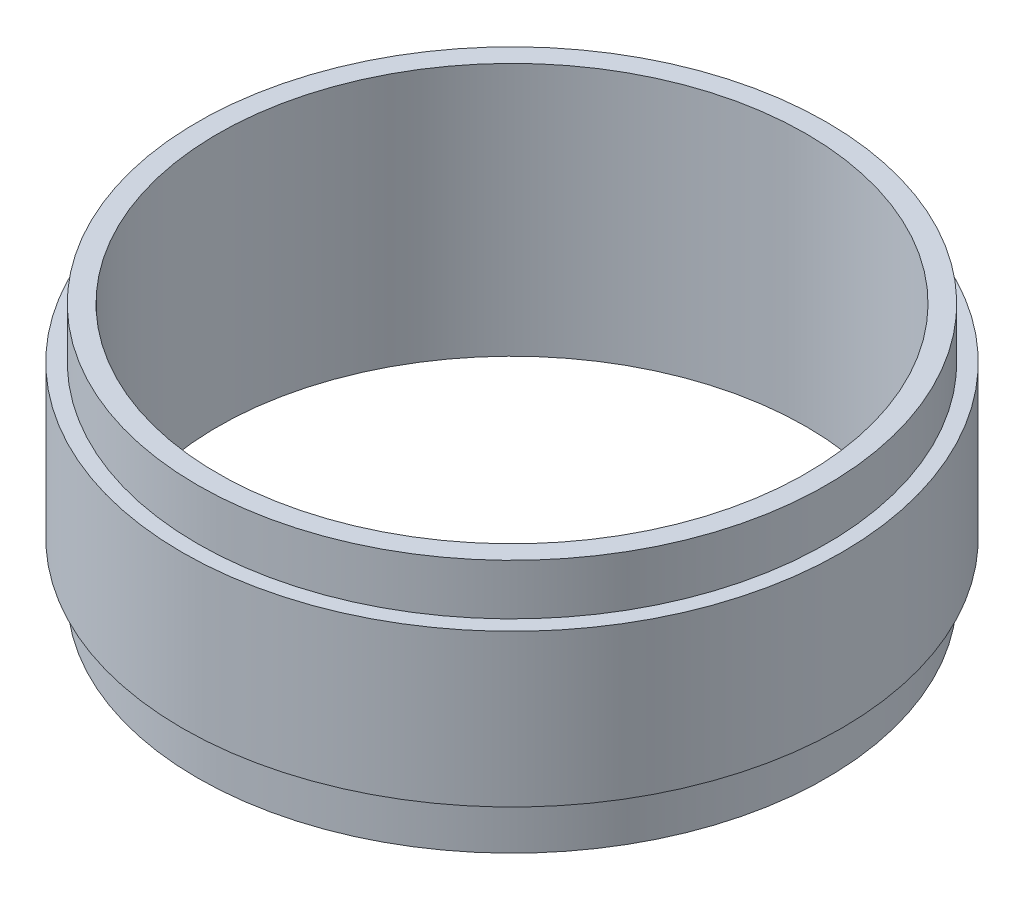
ISO-10303-21;
HEADER;
FILE_DESCRIPTION(('STEP AP214'),'2;1');
FILE_NAME('part.step','',(''),(''),'','','');
FILE_SCHEMA(('AUTOMOTIVE_DESIGN { 1 0 10303 214 1 1 1 1 }'));
ENDSEC;
DATA;
#1=APPLICATION_CONTEXT('core data for automotive mechanical design processes');
#2=APPLICATION_PROTOCOL_DEFINITION('international standard','automotive_design',2000,#1);
#3=PRODUCT_CONTEXT('',#1,'mechanical');
#4=PRODUCT('Part','Part','',(#3));
#5=PRODUCT_RELATED_PRODUCT_CATEGORY('part','',(#4));
#6=PRODUCT_DEFINITION_FORMATION('','',#4);
#7=PRODUCT_DEFINITION_CONTEXT('part definition',#1,'design');
#8=PRODUCT_DEFINITION('design','',#6,#7);
#9=PRODUCT_DEFINITION_SHAPE('','',#8);
#10=(LENGTH_UNIT() NAMED_UNIT(*) SI_UNIT(.MILLI.,.METRE.));
#11=(NAMED_UNIT(*) PLANE_ANGLE_UNIT() SI_UNIT($,.RADIAN.));
#12=(NAMED_UNIT(*) SI_UNIT($,.STERADIAN.) SOLID_ANGLE_UNIT());
#13=UNCERTAINTY_MEASURE_WITH_UNIT(LENGTH_MEASURE(1.E-05),#10,'distance_accuracy_value','');
#14=(GEOMETRIC_REPRESENTATION_CONTEXT(3) GLOBAL_UNCERTAINTY_ASSIGNED_CONTEXT((#13)) GLOBAL_UNIT_ASSIGNED_CONTEXT((#10,
#11,#12)) REPRESENTATION_CONTEXT('',''));
#15=CARTESIAN_POINT('',(0.,0.,0.));
#16=DIRECTION('',(0.,0.,1.));
#17=DIRECTION('',(1.,0.,0.));
#18=AXIS2_PLACEMENT_3D('',#15,#16,#17);
#19=CARTESIAN_POINT('',(0.,0.,0.));
#20=DIRECTION('',(0.,-1.,0.));
#21=DIRECTION('',(0.,0.,-1.));
#22=AXIS2_PLACEMENT_3D('',#19,#20,#21);
#23=CYLINDRICAL_SURFACE('',#22,62.);
#24=CARTESIAN_POINT('',(0.,50.,0.));
#25=DIRECTION('',(0.,-1.,0.));
#26=DIRECTION('',(0.,0.,-1.));
#27=AXIS2_PLACEMENT_3D('',#24,#25,#26);
#28=CIRCLE('',#27,62.);
#29=CARTESIAN_POINT('',(0.,50.,-62.));
#30=VERTEX_POINT('',#29);
#31=EDGE_CURVE('E67',#30,#30,#28,.T.);
#32=ORIENTED_EDGE('',*,*,#31,.T.);
#33=EDGE_LOOP('',(#32));
#34=FACE_BOUND('',#33,.T.);
#35=CARTESIAN_POINT('',(0.,40.,0.));
#36=DIRECTION('',(0.,-1.,0.));
#37=DIRECTION('',(0.,0.,-1.));
#38=AXIS2_PLACEMENT_3D('',#35,#36,#37);
#39=CIRCLE('',#38,62.);
#40=CARTESIAN_POINT('',(0.,40.,-62.));
#41=VERTEX_POINT('',#40);
#42=EDGE_CURVE('E10',#41,#41,#39,.T.);
#43=ORIENTED_EDGE('',*,*,#42,.F.);
#44=EDGE_LOOP('',(#43));
#45=FACE_BOUND('',#44,.T.);
#46=ADVANCED_FACE('F39',(#34,#45),#23,.T.);
#47=CARTESIAN_POINT('',(0.,40.,0.));
#48=DIRECTION('',(0.,1.,0.));
#49=DIRECTION('',(0.,0.,1.));
#50=AXIS2_PLACEMENT_3D('',#47,#48,#49);
#51=PLANE('',#50);
#52=ORIENTED_EDGE('',*,*,#42,.T.);
#53=EDGE_LOOP('',(#52));
#54=FACE_BOUND('',#53,.T.);
#55=CARTESIAN_POINT('',(0.,40.,0.));
#56=DIRECTION('',(0.,-1.,0.));
#57=DIRECTION('',(0.,0.,-1.));
#58=AXIS2_PLACEMENT_3D('',#55,#56,#57);
#59=CIRCLE('',#58,65.);
#60=CARTESIAN_POINT('',(0.,40.,-65.));
#61=VERTEX_POINT('',#60);
#62=EDGE_CURVE('E45',#61,#61,#59,.T.);
#63=ORIENTED_EDGE('',*,*,#62,.F.);
#64=EDGE_LOOP('',(#63));
#65=FACE_BOUND('',#64,.T.);
#66=ADVANCED_FACE('F97',(#54,#65),#51,.T.);
#67=CARTESIAN_POINT('',(0.,0.,0.));
#68=DIRECTION('',(0.,-1.,0.));
#69=DIRECTION('',(0.,0.,-1.));
#70=AXIS2_PLACEMENT_3D('',#67,#68,#69);
#71=CYLINDRICAL_SURFACE('',#70,65.);
#72=ORIENTED_EDGE('',*,*,#62,.T.);
#73=EDGE_LOOP('',(#72));
#74=FACE_BOUND('',#73,.T.);
#75=CARTESIAN_POINT('',(0.,9.99999999999997,0.));
#76=DIRECTION('',(0.,-1.,0.));
#77=DIRECTION('',(0.,0.,-1.));
#78=AXIS2_PLACEMENT_3D('',#75,#76,#77);
#79=CIRCLE('',#78,65.);
#80=CARTESIAN_POINT('',(0.,9.99999999999997,-65.));
#81=VERTEX_POINT('',#80);
#82=EDGE_CURVE('E49',#81,#81,#79,.T.);
#83=ORIENTED_EDGE('',*,*,#82,.F.);
#84=EDGE_LOOP('',(#83));
#85=FACE_BOUND('',#84,.T.);
#86=ADVANCED_FACE('F101',(#74,#85),#71,.T.);
#87=CARTESIAN_POINT('',(0.,9.99999999999997,0.));
#88=DIRECTION('',(0.,1.,0.));
#89=DIRECTION('',(0.,0.,1.));
#90=AXIS2_PLACEMENT_3D('',#87,#88,#89);
#91=PLANE('',#90);
#92=CARTESIAN_POINT('',(0.,9.99999999999997,0.));
#93=DIRECTION('',(0.,-1.,0.));
#94=DIRECTION('',(0.,0.,-1.));
#95=AXIS2_PLACEMENT_3D('',#92,#93,#94);
#96=CIRCLE('',#95,62.);
#97=CARTESIAN_POINT('',(0.,9.99999999999997,-62.));
#98=VERTEX_POINT('',#97);
#99=EDGE_CURVE('E53',#98,#98,#96,.T.);
#100=ORIENTED_EDGE('',*,*,#99,.F.);
#101=EDGE_LOOP('',(#100));
#102=FACE_BOUND('',#101,.T.);
#103=ORIENTED_EDGE('',*,*,#82,.T.);
#104=EDGE_LOOP('',(#103));
#105=FACE_BOUND('',#104,.T.);
#106=ADVANCED_FACE('F93',(#102,#105),#91,.F.);
#107=CARTESIAN_POINT('',(0.,0.,0.));
#108=DIRECTION('',(0.,-1.,0.));
#109=DIRECTION('',(0.,0.,-1.));
#110=AXIS2_PLACEMENT_3D('',#107,#108,#109);
#111=CYLINDRICAL_SURFACE('',#110,62.);
#112=CARTESIAN_POINT('',(0.,0.,0.));
#113=DIRECTION('',(0.,-1.,0.));
#114=DIRECTION('',(0.,0.,-1.));
#115=AXIS2_PLACEMENT_3D('',#112,#113,#114);
#116=CIRCLE('',#115,62.);
#117=CARTESIAN_POINT('',(0.,0.,-62.));
#118=VERTEX_POINT('',#117);
#119=EDGE_CURVE('E58',#118,#118,#116,.T.);
#120=ORIENTED_EDGE('',*,*,#119,.F.);
#121=EDGE_LOOP('',(#120));
#122=FACE_BOUND('',#121,.T.);
#123=ORIENTED_EDGE('',*,*,#99,.T.);
#124=EDGE_LOOP('',(#123));
#125=FACE_BOUND('',#124,.T.);
#126=ADVANCED_FACE('F87',(#122,#125),#111,.T.);
#127=CARTESIAN_POINT('',(0.,0.,0.));
#128=DIRECTION('',(0.,-1.,0.));
#129=DIRECTION('',(0.,0.,-1.));
#130=AXIS2_PLACEMENT_3D('',#127,#128,#129);
#131=PLANE('',#130);
#132=ORIENTED_EDGE('',*,*,#119,.T.);
#133=EDGE_LOOP('',(#132));
#134=FACE_BOUND('',#133,.T.);
#135=CARTESIAN_POINT('',(0.,0.,0.));
#136=DIRECTION('',(0.,-1.,0.));
#137=DIRECTION('',(0.,0.,-1.));
#138=AXIS2_PLACEMENT_3D('',#135,#136,#137);
#139=CIRCLE('',#138,58.);
#140=CARTESIAN_POINT('',(0.,0.,-58.));
#141=VERTEX_POINT('',#140);
#142=EDGE_CURVE('E61',#141,#141,#139,.T.);
#143=ORIENTED_EDGE('',*,*,#142,.F.);
#144=EDGE_LOOP('',(#143));
#145=FACE_BOUND('',#144,.T.);
#146=ADVANCED_FACE('F82',(#134,#145),#131,.T.);
#147=CARTESIAN_POINT('',(0.,0.,0.));
#148=DIRECTION('',(0.,-1.,0.));
#149=DIRECTION('',(0.,0.,-1.));
#150=AXIS2_PLACEMENT_3D('',#147,#148,#149);
#151=CYLINDRICAL_SURFACE('',#150,58.);
#152=CARTESIAN_POINT('',(0.,50.,0.));
#153=DIRECTION('',(0.,-1.,0.));
#154=DIRECTION('',(0.,0.,-1.));
#155=AXIS2_PLACEMENT_3D('',#152,#153,#154);
#156=CIRCLE('',#155,58.);
#157=CARTESIAN_POINT('',(0.,50.,-58.));
#158=VERTEX_POINT('',#157);
#159=EDGE_CURVE('E64',#158,#158,#156,.T.);
#160=ORIENTED_EDGE('',*,*,#159,.F.);
#161=EDGE_LOOP('',(#160));
#162=FACE_BOUND('',#161,.T.);
#163=ORIENTED_EDGE('',*,*,#142,.T.);
#164=EDGE_LOOP('',(#163));
#165=FACE_BOUND('',#164,.T.);
#166=ADVANCED_FACE('F76',(#162,#165),#151,.F.);
#167=CARTESIAN_POINT('',(0.,50.,0.));
#168=DIRECTION('',(0.,-1.,0.));
#169=DIRECTION('',(0.,0.,-1.));
#170=AXIS2_PLACEMENT_3D('',#167,#168,#169);
#171=PLANE('',#170);
#172=ORIENTED_EDGE('',*,*,#31,.F.);
#173=EDGE_LOOP('',(#172));
#174=FACE_BOUND('',#173,.T.);
#175=ORIENTED_EDGE('',*,*,#159,.T.);
#176=EDGE_LOOP('',(#175));
#177=FACE_BOUND('',#176,.T.);
#178=ADVANCED_FACE('F73',(#174,#177),#171,.F.);
#179=CLOSED_SHELL('',(#46,#66,#86,#106,#126,#146,#166,#178));
#180=MANIFOLD_SOLID_BREP('B2',#179);
#181=ADVANCED_BREP_SHAPE_REPRESENTATION('',(#18,#180),#14);
#182=SHAPE_DEFINITION_REPRESENTATION(#9,#181);
ENDSEC;
END-ISO-10303-21;
